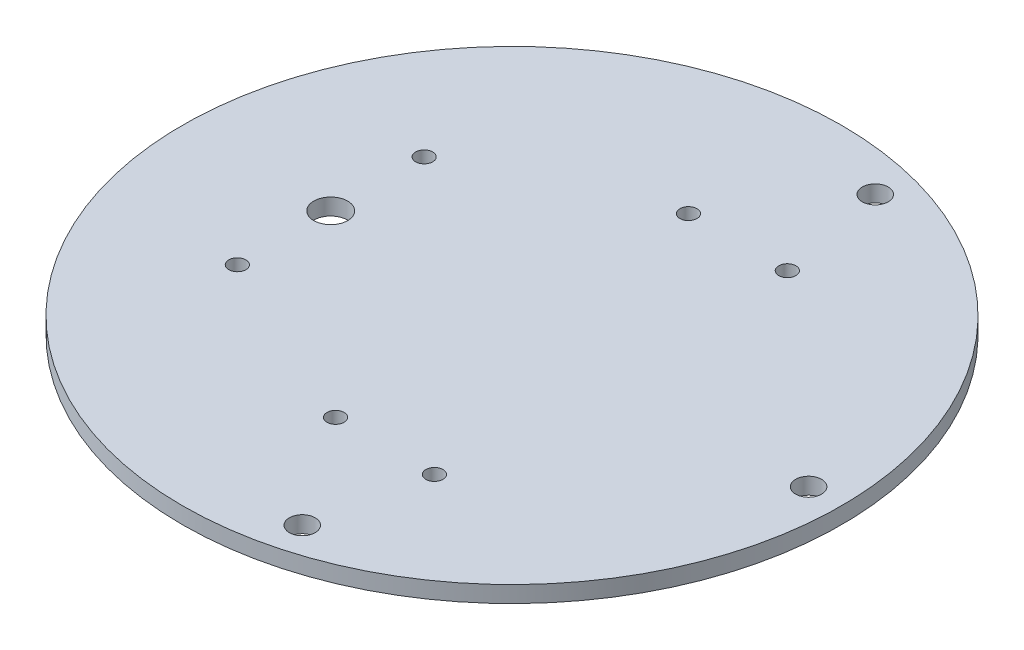
ISO-10303-21;
HEADER;
FILE_DESCRIPTION(('STEP AP214'),'2;1');
FILE_NAME('part.step','',(''),(''),'','','');
FILE_SCHEMA(('AUTOMOTIVE_DESIGN { 1 0 10303 214 1 1 1 1 }'));
ENDSEC;
DATA;
#1=APPLICATION_CONTEXT('core data for automotive mechanical design processes');
#2=APPLICATION_PROTOCOL_DEFINITION('international standard','automotive_design',2000,#1);
#3=PRODUCT_CONTEXT('',#1,'mechanical');
#4=PRODUCT('Part','Part','',(#3));
#5=PRODUCT_RELATED_PRODUCT_CATEGORY('part','',(#4));
#6=PRODUCT_DEFINITION_FORMATION('','',#4);
#7=PRODUCT_DEFINITION_CONTEXT('part definition',#1,'design');
#8=PRODUCT_DEFINITION('design','',#6,#7);
#9=PRODUCT_DEFINITION_SHAPE('','',#8);
#10=(LENGTH_UNIT() NAMED_UNIT(*) SI_UNIT(.MILLI.,.METRE.));
#11=(NAMED_UNIT(*) PLANE_ANGLE_UNIT() SI_UNIT($,.RADIAN.));
#12=(NAMED_UNIT(*) SI_UNIT($,.STERADIAN.) SOLID_ANGLE_UNIT());
#13=UNCERTAINTY_MEASURE_WITH_UNIT(LENGTH_MEASURE(1.E-05),#10,'distance_accuracy_value','');
#14=(GEOMETRIC_REPRESENTATION_CONTEXT(3) GLOBAL_UNCERTAINTY_ASSIGNED_CONTEXT((#13)) GLOBAL_UNIT_ASSIGNED_CONTEXT((#10,
#11,#12)) REPRESENTATION_CONTEXT('',''));
#15=CARTESIAN_POINT('',(0.,0.,0.));
#16=DIRECTION('',(0.,0.,1.));
#17=DIRECTION('',(1.,0.,0.));
#18=AXIS2_PLACEMENT_3D('',#15,#16,#17);
#19=CARTESIAN_POINT('',(0.,3.175,0.));
#20=DIRECTION('',(0.,-1.,0.));
#21=DIRECTION('',(0.,0.,-1.));
#22=AXIS2_PLACEMENT_3D('',#19,#20,#21);
#23=CYLINDRICAL_SURFACE('',#22,63.5);
#24=CARTESIAN_POINT('',(0.,3.175,0.));
#25=DIRECTION('',(0.,1.,0.));
#26=DIRECTION('',(0.,0.,1.));
#27=AXIS2_PLACEMENT_3D('',#24,#25,#26);
#28=CIRCLE('',#27,63.5);
#29=CARTESIAN_POINT('',(0.,3.175,63.5));
#30=VERTEX_POINT('',#29);
#31=EDGE_CURVE('E10',#30,#30,#28,.T.);
#32=ORIENTED_EDGE('',*,*,#31,.F.);
#33=EDGE_LOOP('',(#32));
#34=FACE_BOUND('',#33,.T.);
#35=CARTESIAN_POINT('',(0.,0.,0.));
#36=DIRECTION('',(0.,1.,0.));
#37=DIRECTION('',(0.,0.,1.));
#38=AXIS2_PLACEMENT_3D('',#35,#36,#37);
#39=CIRCLE('',#38,63.5);
#40=CARTESIAN_POINT('',(0.,0.,63.5));
#41=VERTEX_POINT('',#40);
#42=EDGE_CURVE('E45',#41,#41,#39,.T.);
#43=ORIENTED_EDGE('',*,*,#42,.T.);
#44=EDGE_LOOP('',(#43));
#45=FACE_BOUND('',#44,.T.);
#46=ADVANCED_FACE('F42',(#34,#45),#23,.T.);
#47=CARTESIAN_POINT('',(0.,3.175,0.));
#48=DIRECTION('',(0.,1.,0.));
#49=DIRECTION('',(0.,0.,1.));
#50=AXIS2_PLACEMENT_3D('',#47,#48,#49);
#51=PLANE('',#50);
#52=CARTESIAN_POINT('',(19.05,3.175,34.));
#53=DIRECTION('',(0.,1.,0.));
#54=DIRECTION('',(0.,0.,1.));
#55=AXIS2_PLACEMENT_3D('',#52,#53,#54);
#56=CIRCLE('',#55,1.64999999999999);
#57=CARTESIAN_POINT('',(19.05,3.175,35.65));
#58=VERTEX_POINT('',#57);
#59=EDGE_CURVE('E95',#58,#58,#56,.T.);
#60=ORIENTED_EDGE('',*,*,#59,.F.);
#61=EDGE_LOOP('',(#60));
#62=FACE_BOUND('',#61,.T.);
#63=CARTESIAN_POINT('',(19.05,3.175,-34.));
#64=DIRECTION('',(0.,1.,0.));
#65=DIRECTION('',(0.,0.,1.));
#66=AXIS2_PLACEMENT_3D('',#63,#64,#65);
#67=CIRCLE('',#66,1.65);
#68=CARTESIAN_POINT('',(19.05,3.175,-32.35));
#69=VERTEX_POINT('',#68);
#70=EDGE_CURVE('E99',#69,#69,#67,.T.);
#71=ORIENTED_EDGE('',*,*,#70,.F.);
#72=EDGE_LOOP('',(#71));
#73=FACE_BOUND('',#72,.T.);
#74=CARTESIAN_POINT('',(-34.925,3.175,17.9999894));
#75=DIRECTION('',(0.,1.,0.));
#76=DIRECTION('',(0.,0.,1.));
#77=AXIS2_PLACEMENT_3D('',#74,#75,#76);
#78=CIRCLE('',#77,1.65);
#79=CARTESIAN_POINT('',(-34.925,3.175,19.6499894));
#80=VERTEX_POINT('',#79);
#81=EDGE_CURVE('E103',#80,#80,#78,.T.);
#82=ORIENTED_EDGE('',*,*,#81,.F.);
#83=EDGE_LOOP('',(#82));
#84=FACE_BOUND('',#83,.T.);
#85=CARTESIAN_POINT('',(-34.925,3.175,0.));
#86=DIRECTION('',(0.,1.,0.));
#87=DIRECTION('',(0.,0.,1.));
#88=AXIS2_PLACEMENT_3D('',#85,#86,#87);
#89=CIRCLE('',#88,3.2639);
#90=CARTESIAN_POINT('',(-34.925,3.175,3.26389999999999));
#91=VERTEX_POINT('',#90);
#92=EDGE_CURVE('E107',#91,#91,#89,.T.);
#93=ORIENTED_EDGE('',*,*,#92,.F.);
#94=EDGE_LOOP('',(#93));
#95=FACE_BOUND('',#94,.T.);
#96=CARTESIAN_POINT('',(-34.925,3.175,-17.9999894));
#97=DIRECTION('',(0.,1.,0.));
#98=DIRECTION('',(0.,0.,1.));
#99=AXIS2_PLACEMENT_3D('',#96,#97,#98);
#100=CIRCLE('',#99,1.65);
#101=CARTESIAN_POINT('',(-34.925,3.175,-16.3499894));
#102=VERTEX_POINT('',#101);
#103=EDGE_CURVE('E111',#102,#102,#100,.T.);
#104=ORIENTED_EDGE('',*,*,#103,.F.);
#105=EDGE_LOOP('',(#104));
#106=FACE_BOUND('',#105,.T.);
#107=CARTESIAN_POINT('',(14.7915084276093,3.175,-55.2026609724202));
#108=DIRECTION('',(0.,1.,0.));
#109=DIRECTION('',(0.,0.,1.));
#110=AXIS2_PLACEMENT_3D('',#107,#108,#109);
#111=CIRCLE('',#110,2.48919999999999);
#112=CARTESIAN_POINT('',(14.7915084276093,3.175,-52.7134609724202));
#113=VERTEX_POINT('',#112);
#114=EDGE_CURVE('E91',#113,#113,#111,.T.);
#115=ORIENTED_EDGE('',*,*,#114,.F.);
#116=EDGE_LOOP('',(#115));
#117=FACE_BOUND('',#116,.T.);
#118=CARTESIAN_POINT('',(57.15,3.175,0.));
#119=DIRECTION('',(0.,1.,0.));
#120=DIRECTION('',(0.,0.,1.));
#121=AXIS2_PLACEMENT_3D('',#118,#119,#120);
#122=CIRCLE('',#121,2.48919999999999);
#123=CARTESIAN_POINT('',(57.15,3.175,2.48919999999999));
#124=VERTEX_POINT('',#123);
#125=EDGE_CURVE('E83',#124,#124,#122,.T.);
#126=ORIENTED_EDGE('',*,*,#125,.F.);
#127=EDGE_LOOP('',(#126));
#128=FACE_BOUND('',#127,.T.);
#129=CARTESIAN_POINT('',(14.7915084276089,3.175,55.2026609724203));
#130=DIRECTION('',(0.,1.,0.));
#131=DIRECTION('',(0.,0.,1.));
#132=AXIS2_PLACEMENT_3D('',#129,#130,#131);
#133=CIRCLE('',#132,2.48919999999999);
#134=CARTESIAN_POINT('',(14.7915084276089,3.175,57.6918609724203));
#135=VERTEX_POINT('',#134);
#136=EDGE_CURVE('E75',#135,#135,#133,.T.);
#137=ORIENTED_EDGE('',*,*,#136,.F.);
#138=EDGE_LOOP('',(#137));
#139=FACE_BOUND('',#138,.T.);
#140=CARTESIAN_POINT('',(0.,3.175,-34.));
#141=DIRECTION('',(0.,1.,0.));
#142=DIRECTION('',(0.,0.,1.));
#143=AXIS2_PLACEMENT_3D('',#140,#141,#142);
#144=CIRCLE('',#143,1.65);
#145=CARTESIAN_POINT('',(0.,3.175,-32.35));
#146=VERTEX_POINT('',#145);
#147=EDGE_CURVE('E67',#146,#146,#144,.T.);
#148=ORIENTED_EDGE('',*,*,#147,.F.);
#149=EDGE_LOOP('',(#148));
#150=FACE_BOUND('',#149,.T.);
#151=CARTESIAN_POINT('',(0.,3.175,34.));
#152=DIRECTION('',(0.,1.,0.));
#153=DIRECTION('',(0.,0.,1.));
#154=AXIS2_PLACEMENT_3D('',#151,#152,#153);
#155=CIRCLE('',#154,1.65);
#156=CARTESIAN_POINT('',(0.,3.175,35.65));
#157=VERTEX_POINT('',#156);
#158=EDGE_CURVE('E59',#157,#157,#155,.T.);
#159=ORIENTED_EDGE('',*,*,#158,.F.);
#160=EDGE_LOOP('',(#159));
#161=FACE_BOUND('',#160,.T.);
#162=ORIENTED_EDGE('',*,*,#31,.T.);
#163=EDGE_LOOP('',(#162));
#164=FACE_BOUND('',#163,.T.);
#165=ADVANCED_FACE('F156',(#62,#73,#84,#95,#106,#117,#128,#139,#150,#161,#164),#51,.T.);
#166=CARTESIAN_POINT('',(0.,0.,0.));
#167=DIRECTION('',(0.,1.,0.));
#168=DIRECTION('',(0.,0.,1.));
#169=AXIS2_PLACEMENT_3D('',#166,#167,#168);
#170=PLANE('',#169);
#171=CARTESIAN_POINT('',(19.05,0.,34.));
#172=DIRECTION('',(0.,1.,0.));
#173=DIRECTION('',(0.,0.,-1.));
#174=AXIS2_PLACEMENT_3D('',#171,#172,#173);
#175=CIRCLE('',#174,1.64999999999999);
#176=CARTESIAN_POINT('',(19.05,0.,32.35));
#177=VERTEX_POINT('',#176);
#178=EDGE_CURVE('E120',#177,#177,#175,.T.);
#179=ORIENTED_EDGE('',*,*,#178,.T.);
#180=EDGE_LOOP('',(#179));
#181=FACE_BOUND('',#180,.T.);
#182=CARTESIAN_POINT('',(19.05,0.,-34.));
#183=DIRECTION('',(0.,1.,0.));
#184=DIRECTION('',(0.,0.,1.));
#185=AXIS2_PLACEMENT_3D('',#182,#183,#184);
#186=CIRCLE('',#185,1.65);
#187=CARTESIAN_POINT('',(19.05,0.,-32.35));
#188=VERTEX_POINT('',#187);
#189=EDGE_CURVE('E124',#188,#188,#186,.T.);
#190=ORIENTED_EDGE('',*,*,#189,.T.);
#191=EDGE_LOOP('',(#190));
#192=FACE_BOUND('',#191,.T.);
#193=CARTESIAN_POINT('',(-34.925,0.,17.9999894));
#194=DIRECTION('',(0.,1.,0.));
#195=DIRECTION('',(0.,0.,-1.));
#196=AXIS2_PLACEMENT_3D('',#193,#194,#195);
#197=CIRCLE('',#196,1.65);
#198=CARTESIAN_POINT('',(-34.925,0.,16.3499894));
#199=VERTEX_POINT('',#198);
#200=EDGE_CURVE('E128',#199,#199,#197,.T.);
#201=ORIENTED_EDGE('',*,*,#200,.T.);
#202=EDGE_LOOP('',(#201));
#203=FACE_BOUND('',#202,.T.);
#204=CARTESIAN_POINT('',(-34.925,0.,0.));
#205=DIRECTION('',(0.,1.,0.));
#206=DIRECTION('',(0.,0.,1.));
#207=AXIS2_PLACEMENT_3D('',#204,#205,#206);
#208=CIRCLE('',#207,3.2639);
#209=CARTESIAN_POINT('',(-34.925,0.,3.26389999999999));
#210=VERTEX_POINT('',#209);
#211=EDGE_CURVE('E119',#210,#210,#208,.T.);
#212=ORIENTED_EDGE('',*,*,#211,.T.);
#213=EDGE_LOOP('',(#212));
#214=FACE_BOUND('',#213,.T.);
#215=CARTESIAN_POINT('',(-34.925,0.,-17.9999894));
#216=DIRECTION('',(0.,1.,0.));
#217=DIRECTION('',(0.,0.,1.));
#218=AXIS2_PLACEMENT_3D('',#215,#216,#217);
#219=CIRCLE('',#218,1.65);
#220=CARTESIAN_POINT('',(-34.925,0.,-16.3499894));
#221=VERTEX_POINT('',#220);
#222=EDGE_CURVE('E115',#221,#221,#219,.T.);
#223=ORIENTED_EDGE('',*,*,#222,.T.);
#224=EDGE_LOOP('',(#223));
#225=FACE_BOUND('',#224,.T.);
#226=CARTESIAN_POINT('',(14.7915084276093,0.,-55.2026609724202));
#227=DIRECTION('',(0.,1.,0.));
#228=DIRECTION('',(0.,0.,1.));
#229=AXIS2_PLACEMENT_3D('',#226,#227,#228);
#230=CIRCLE('',#229,2.4892);
#231=CARTESIAN_POINT('',(14.7915084276093,0.,-52.7134609724202));
#232=VERTEX_POINT('',#231);
#233=EDGE_CURVE('E87',#232,#232,#230,.T.);
#234=ORIENTED_EDGE('',*,*,#233,.T.);
#235=EDGE_LOOP('',(#234));
#236=FACE_BOUND('',#235,.T.);
#237=CARTESIAN_POINT('',(57.15,0.,0.));
#238=DIRECTION('',(0.,1.,0.));
#239=DIRECTION('',(0.,0.,1.));
#240=AXIS2_PLACEMENT_3D('',#237,#238,#239);
#241=CIRCLE('',#240,2.4892);
#242=CARTESIAN_POINT('',(57.15,0.,2.4892));
#243=VERTEX_POINT('',#242);
#244=EDGE_CURVE('E79',#243,#243,#241,.T.);
#245=ORIENTED_EDGE('',*,*,#244,.T.);
#246=EDGE_LOOP('',(#245));
#247=FACE_BOUND('',#246,.T.);
#248=CARTESIAN_POINT('',(14.7915084276089,0.,55.2026609724203));
#249=DIRECTION('',(0.,1.,0.));
#250=DIRECTION('',(0.,0.,1.));
#251=AXIS2_PLACEMENT_3D('',#248,#249,#250);
#252=CIRCLE('',#251,2.4892);
#253=CARTESIAN_POINT('',(14.7915084276089,0.,57.6918609724203));
#254=VERTEX_POINT('',#253);
#255=EDGE_CURVE('E71',#254,#254,#252,.T.);
#256=ORIENTED_EDGE('',*,*,#255,.T.);
#257=EDGE_LOOP('',(#256));
#258=FACE_BOUND('',#257,.T.);
#259=CARTESIAN_POINT('',(0.,0.,-34.));
#260=DIRECTION('',(0.,1.,0.));
#261=DIRECTION('',(0.,0.,1.));
#262=AXIS2_PLACEMENT_3D('',#259,#260,#261);
#263=CIRCLE('',#262,1.65);
#264=CARTESIAN_POINT('',(0.,0.,-32.35));
#265=VERTEX_POINT('',#264);
#266=EDGE_CURVE('E63',#265,#265,#263,.T.);
#267=ORIENTED_EDGE('',*,*,#266,.T.);
#268=EDGE_LOOP('',(#267));
#269=FACE_BOUND('',#268,.T.);
#270=CARTESIAN_POINT('',(0.,0.,34.));
#271=DIRECTION('',(0.,1.,0.));
#272=DIRECTION('',(0.,0.,1.));
#273=AXIS2_PLACEMENT_3D('',#270,#271,#272);
#274=CIRCLE('',#273,1.65);
#275=CARTESIAN_POINT('',(0.,0.,35.65));
#276=VERTEX_POINT('',#275);
#277=EDGE_CURVE('E54',#276,#276,#274,.T.);
#278=ORIENTED_EDGE('',*,*,#277,.T.);
#279=EDGE_LOOP('',(#278));
#280=FACE_BOUND('',#279,.T.);
#281=ORIENTED_EDGE('',*,*,#42,.F.);
#282=EDGE_LOOP('',(#281));
#283=FACE_BOUND('',#282,.T.);
#284=ADVANCED_FACE('F136',(#181,#192,#203,#214,#225,#236,#247,#258,#269,#280,#283),#170,.F.);
#285=CARTESIAN_POINT('',(0.,3.175,34.));
#286=DIRECTION('',(0.,1.,0.));
#287=DIRECTION('',(0.,0.,1.));
#288=AXIS2_PLACEMENT_3D('',#285,#286,#287);
#289=CYLINDRICAL_SURFACE('',#288,1.65);
#290=ORIENTED_EDGE('',*,*,#277,.F.);
#291=EDGE_LOOP('',(#290));
#292=FACE_BOUND('',#291,.T.);
#293=ORIENTED_EDGE('',*,*,#158,.T.);
#294=EDGE_LOOP('',(#293));
#295=FACE_BOUND('',#294,.T.);
#296=ADVANCED_FACE('F168',(#292,#295),#289,.F.);
#297=CARTESIAN_POINT('',(0.,3.175,-34.));
#298=DIRECTION('',(0.,1.,0.));
#299=DIRECTION('',(0.,0.,1.));
#300=AXIS2_PLACEMENT_3D('',#297,#298,#299);
#301=CYLINDRICAL_SURFACE('',#300,1.65);
#302=ORIENTED_EDGE('',*,*,#266,.F.);
#303=EDGE_LOOP('',(#302));
#304=FACE_BOUND('',#303,.T.);
#305=ORIENTED_EDGE('',*,*,#147,.T.);
#306=EDGE_LOOP('',(#305));
#307=FACE_BOUND('',#306,.T.);
#308=ADVANCED_FACE('F172',(#304,#307),#301,.F.);
#309=CARTESIAN_POINT('',(14.7915084276089,3.175,55.2026609724203));
#310=DIRECTION('',(0.,1.,0.));
#311=DIRECTION('',(0.,0.,1.));
#312=AXIS2_PLACEMENT_3D('',#309,#310,#311);
#313=CYLINDRICAL_SURFACE('',#312,2.4892);
#314=ORIENTED_EDGE('',*,*,#255,.F.);
#315=EDGE_LOOP('',(#314));
#316=FACE_BOUND('',#315,.T.);
#317=ORIENTED_EDGE('',*,*,#136,.T.);
#318=EDGE_LOOP('',(#317));
#319=FACE_BOUND('',#318,.T.);
#320=ADVANCED_FACE('F179',(#316,#319),#313,.F.);
#321=CARTESIAN_POINT('',(57.15,3.175,0.));
#322=DIRECTION('',(0.,1.,0.));
#323=DIRECTION('',(0.,0.,1.));
#324=AXIS2_PLACEMENT_3D('',#321,#322,#323);
#325=CYLINDRICAL_SURFACE('',#324,2.48919999999999);
#326=ORIENTED_EDGE('',*,*,#244,.F.);
#327=EDGE_LOOP('',(#326));
#328=FACE_BOUND('',#327,.T.);
#329=ORIENTED_EDGE('',*,*,#125,.T.);
#330=EDGE_LOOP('',(#329));
#331=FACE_BOUND('',#330,.T.);
#332=ADVANCED_FACE('F183',(#328,#331),#325,.F.);
#333=CARTESIAN_POINT('',(14.7915084276093,3.175,-55.2026609724202));
#334=DIRECTION('',(0.,1.,0.));
#335=DIRECTION('',(0.,0.,1.));
#336=AXIS2_PLACEMENT_3D('',#333,#334,#335);
#337=CYLINDRICAL_SURFACE('',#336,2.48919999999999);
#338=ORIENTED_EDGE('',*,*,#233,.F.);
#339=EDGE_LOOP('',(#338));
#340=FACE_BOUND('',#339,.T.);
#341=ORIENTED_EDGE('',*,*,#114,.T.);
#342=EDGE_LOOP('',(#341));
#343=FACE_BOUND('',#342,.T.);
#344=ADVANCED_FACE('F152',(#340,#343),#337,.F.);
#345=CARTESIAN_POINT('',(-34.925,0.,-17.9999894));
#346=DIRECTION('',(0.,1.,0.));
#347=DIRECTION('',(0.,0.,1.));
#348=AXIS2_PLACEMENT_3D('',#345,#346,#347);
#349=CYLINDRICAL_SURFACE('',#348,1.65);
#350=ORIENTED_EDGE('',*,*,#103,.T.);
#351=EDGE_LOOP('',(#350));
#352=FACE_BOUND('',#351,.T.);
#353=ORIENTED_EDGE('',*,*,#222,.F.);
#354=EDGE_LOOP('',(#353));
#355=FACE_BOUND('',#354,.T.);
#356=ADVANCED_FACE('F142',(#352,#355),#349,.F.);
#357=CARTESIAN_POINT('',(-34.925,0.,0.));
#358=DIRECTION('',(0.,1.,0.));
#359=DIRECTION('',(0.,0.,1.));
#360=AXIS2_PLACEMENT_3D('',#357,#358,#359);
#361=CYLINDRICAL_SURFACE('',#360,3.2639);
#362=ORIENTED_EDGE('',*,*,#92,.T.);
#363=EDGE_LOOP('',(#362));
#364=FACE_BOUND('',#363,.T.);
#365=ORIENTED_EDGE('',*,*,#211,.F.);
#366=EDGE_LOOP('',(#365));
#367=FACE_BOUND('',#366,.T.);
#368=ADVANCED_FACE('F139',(#364,#367),#361,.F.);
#369=CARTESIAN_POINT('',(-34.925,0.,17.9999894));
#370=DIRECTION('',(0.,1.,0.));
#371=DIRECTION('',(0.,0.,1.));
#372=AXIS2_PLACEMENT_3D('',#369,#370,#371);
#373=CYLINDRICAL_SURFACE('',#372,1.65);
#374=ORIENTED_EDGE('',*,*,#81,.T.);
#375=EDGE_LOOP('',(#374));
#376=FACE_BOUND('',#375,.T.);
#377=ORIENTED_EDGE('',*,*,#200,.F.);
#378=EDGE_LOOP('',(#377));
#379=FACE_BOUND('',#378,.T.);
#380=ADVANCED_FACE('F141',(#376,#379),#373,.F.);
#381=CARTESIAN_POINT('',(19.05,0.,-34.));
#382=DIRECTION('',(0.,1.,0.));
#383=DIRECTION('',(0.,0.,1.));
#384=AXIS2_PLACEMENT_3D('',#381,#382,#383);
#385=CYLINDRICAL_SURFACE('',#384,1.65);
#386=ORIENTED_EDGE('',*,*,#70,.T.);
#387=EDGE_LOOP('',(#386));
#388=FACE_BOUND('',#387,.T.);
#389=ORIENTED_EDGE('',*,*,#189,.F.);
#390=EDGE_LOOP('',(#389));
#391=FACE_BOUND('',#390,.T.);
#392=ADVANCED_FACE('F149',(#388,#391),#385,.F.);
#393=CARTESIAN_POINT('',(19.05,0.,34.));
#394=DIRECTION('',(0.,1.,0.));
#395=DIRECTION('',(0.,0.,1.));
#396=AXIS2_PLACEMENT_3D('',#393,#394,#395);
#397=CYLINDRICAL_SURFACE('',#396,1.64999999999999);
#398=ORIENTED_EDGE('',*,*,#59,.T.);
#399=EDGE_LOOP('',(#398));
#400=FACE_BOUND('',#399,.T.);
#401=ORIENTED_EDGE('',*,*,#178,.F.);
#402=EDGE_LOOP('',(#401));
#403=FACE_BOUND('',#402,.T.);
#404=ADVANCED_FACE('F191',(#400,#403),#397,.F.);
#405=CLOSED_SHELL('',(#46,#165,#284,#296,#308,#320,#332,#344,#356,#368,#380,#392,#404));
#406=MANIFOLD_SOLID_BREP('B2',#405);
#407=ADVANCED_BREP_SHAPE_REPRESENTATION('',(#18,#406),#14);
#408=SHAPE_DEFINITION_REPRESENTATION(#9,#407);
ENDSEC;
END-ISO-10303-21;
